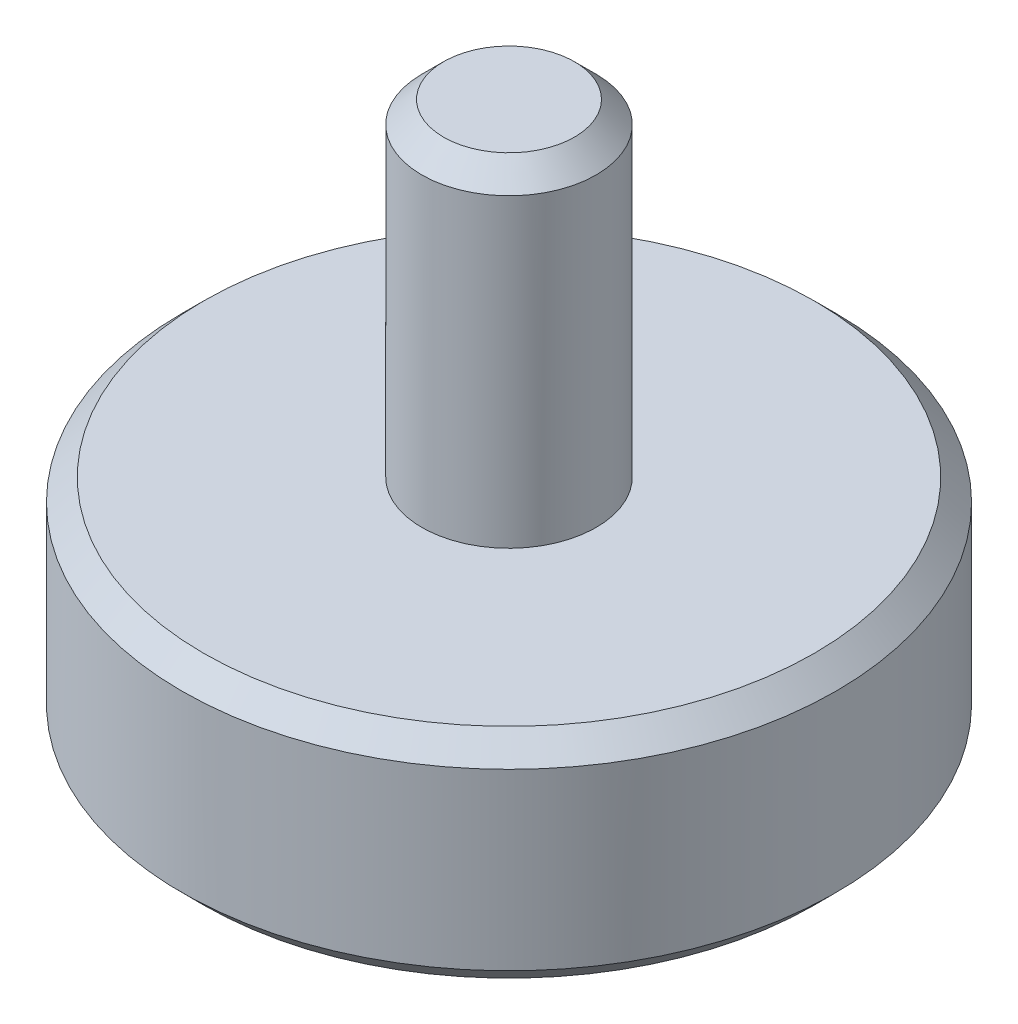
ISO-10303-21;
HEADER;
FILE_DESCRIPTION(('STEP AP214'),'2;1');
FILE_NAME('part.step','',(''),(''),'','','');
FILE_SCHEMA(('AUTOMOTIVE_DESIGN { 1 0 10303 214 1 1 1 1 }'));
ENDSEC;
DATA;
#1=APPLICATION_CONTEXT('core data for automotive mechanical design processes');
#2=APPLICATION_PROTOCOL_DEFINITION('international standard','automotive_design',2000,#1);
#3=PRODUCT_CONTEXT('',#1,'mechanical');
#4=PRODUCT('Part','Part','',(#3));
#5=PRODUCT_RELATED_PRODUCT_CATEGORY('part','',(#4));
#6=PRODUCT_DEFINITION_FORMATION('','',#4);
#7=PRODUCT_DEFINITION_CONTEXT('part definition',#1,'design');
#8=PRODUCT_DEFINITION('design','',#6,#7);
#9=PRODUCT_DEFINITION_SHAPE('','',#8);
#10=(LENGTH_UNIT() NAMED_UNIT(*) SI_UNIT(.MILLI.,.METRE.));
#11=(NAMED_UNIT(*) PLANE_ANGLE_UNIT() SI_UNIT($,.RADIAN.));
#12=(NAMED_UNIT(*) SI_UNIT($,.STERADIAN.) SOLID_ANGLE_UNIT());
#13=UNCERTAINTY_MEASURE_WITH_UNIT(LENGTH_MEASURE(1.E-05),#10,'distance_accuracy_value','');
#14=(GEOMETRIC_REPRESENTATION_CONTEXT(3) GLOBAL_UNCERTAINTY_ASSIGNED_CONTEXT((#13)) GLOBAL_UNIT_ASSIGNED_CONTEXT((#10,
#11,#12)) REPRESENTATION_CONTEXT('',''));
#15=CARTESIAN_POINT('',(0.,0.,0.));
#16=DIRECTION('',(0.,0.,1.));
#17=DIRECTION('',(1.,0.,0.));
#18=AXIS2_PLACEMENT_3D('',#15,#16,#17);
#19=CARTESIAN_POINT('',(0.,25.,0.));
#20=DIRECTION('',(0.,1.,0.));
#21=DIRECTION('',(0.,0.,1.));
#22=AXIS2_PLACEMENT_3D('',#19,#20,#21);
#23=PLANE('',#22);
#24=CARTESIAN_POINT('',(0.,25.,0.));
#25=DIRECTION('',(0.,1.,0.));
#26=DIRECTION('',(0.,0.,1.));
#27=AXIS2_PLACEMENT_3D('',#24,#25,#26);
#28=CIRCLE('',#27,3.);
#29=CARTESIAN_POINT('',(0.,25.,3.));
#30=VERTEX_POINT('',#29);
#31=EDGE_CURVE('E55',#30,#30,#28,.T.);
#32=ORIENTED_EDGE('',*,*,#31,.T.);
#33=EDGE_LOOP('',(#32));
#34=FACE_BOUND('',#33,.T.);
#35=ADVANCED_FACE('F34',(#34),#23,.T.);
#36=CARTESIAN_POINT('',(0.,0.,0.));
#37=DIRECTION('',(0.,-1.,0.));
#38=DIRECTION('',(0.,0.,-1.));
#39=AXIS2_PLACEMENT_3D('',#36,#37,#38);
#40=CYLINDRICAL_SURFACE('',#39,4.);
#41=CARTESIAN_POINT('',(0.,24.,0.));
#42=DIRECTION('',(0.,1.,0.));
#43=DIRECTION('',(0.,0.,1.));
#44=AXIS2_PLACEMENT_3D('',#41,#42,#43);
#45=CIRCLE('',#44,4.);
#46=CARTESIAN_POINT('',(0.,24.,4.));
#47=VERTEX_POINT('',#46);
#48=EDGE_CURVE('E58',#47,#47,#45,.F.);
#49=ORIENTED_EDGE('',*,*,#48,.T.);
#50=EDGE_LOOP('',(#49));
#51=FACE_BOUND('',#50,.T.);
#52=CARTESIAN_POINT('',(0.,10.,0.));
#53=DIRECTION('',(0.,-1.,0.));
#54=DIRECTION('',(0.,0.,-1.));
#55=AXIS2_PLACEMENT_3D('',#52,#53,#54);
#56=CIRCLE('',#55,4.);
#57=CARTESIAN_POINT('',(0.,10.,-4.));
#58=VERTEX_POINT('',#57);
#59=EDGE_CURVE('E61',#58,#58,#56,.T.);
#60=ORIENTED_EDGE('',*,*,#59,.F.);
#61=EDGE_LOOP('',(#60));
#62=FACE_BOUND('',#61,.T.);
#63=ADVANCED_FACE('F67',(#51,#62),#40,.T.);
#64=CARTESIAN_POINT('',(4.,10.,0.));
#65=DIRECTION('',(0.,1.,0.));
#66=DIRECTION('',(0.,0.,1.));
#67=AXIS2_PLACEMENT_3D('',#64,#65,#66);
#68=PLANE('',#67);
#69=CARTESIAN_POINT('',(0.,10.,0.));
#70=DIRECTION('',(0.,1.,0.));
#71=DIRECTION('',(0.,0.,1.));
#72=AXIS2_PLACEMENT_3D('',#69,#70,#71);
#73=CIRCLE('',#72,14.);
#74=CARTESIAN_POINT('',(0.,10.,14.));
#75=VERTEX_POINT('',#74);
#76=EDGE_CURVE('E10',#75,#75,#73,.T.);
#77=ORIENTED_EDGE('',*,*,#76,.T.);
#78=EDGE_LOOP('',(#77));
#79=FACE_BOUND('',#78,.T.);
#80=ORIENTED_EDGE('',*,*,#59,.T.);
#81=EDGE_LOOP('',(#80));
#82=FACE_BOUND('',#81,.T.);
#83=ADVANCED_FACE('F65',(#79,#82),#68,.T.);
#84=CARTESIAN_POINT('',(0.,0.,0.));
#85=DIRECTION('',(0.,-1.,0.));
#86=DIRECTION('',(0.,0.,-1.));
#87=AXIS2_PLACEMENT_3D('',#84,#85,#86);
#88=CYLINDRICAL_SURFACE('',#87,15.);
#89=CARTESIAN_POINT('',(0.,1.00000000000001,0.));
#90=DIRECTION('',(0.,-1.,0.));
#91=DIRECTION('',(0.,0.,-1.));
#92=AXIS2_PLACEMENT_3D('',#89,#90,#91);
#93=CIRCLE('',#92,15.);
#94=CARTESIAN_POINT('',(0.,1.00000000000001,-15.));
#95=VERTEX_POINT('',#94);
#96=EDGE_CURVE('E42',#95,#95,#93,.F.);
#97=ORIENTED_EDGE('',*,*,#96,.T.);
#98=EDGE_LOOP('',(#97));
#99=FACE_BOUND('',#98,.T.);
#100=CARTESIAN_POINT('',(0.,8.99999999999998,0.));
#101=DIRECTION('',(0.,1.,0.));
#102=DIRECTION('',(0.,0.,1.));
#103=AXIS2_PLACEMENT_3D('',#100,#101,#102);
#104=CIRCLE('',#103,15.);
#105=CARTESIAN_POINT('',(0.,8.99999999999998,15.));
#106=VERTEX_POINT('',#105);
#107=EDGE_CURVE('E46',#106,#106,#104,.F.);
#108=ORIENTED_EDGE('',*,*,#107,.T.);
#109=EDGE_LOOP('',(#108));
#110=FACE_BOUND('',#109,.T.);
#111=ADVANCED_FACE('F75',(#99,#110),#88,.T.);
#112=CARTESIAN_POINT('',(15.,0.,0.));
#113=DIRECTION('',(0.,-1.,0.));
#114=DIRECTION('',(0.,0.,-1.));
#115=AXIS2_PLACEMENT_3D('',#112,#113,#114);
#116=PLANE('',#115);
#117=CARTESIAN_POINT('',(0.,0.,0.));
#118=DIRECTION('',(0.,-1.,0.));
#119=DIRECTION('',(0.,0.,-1.));
#120=AXIS2_PLACEMENT_3D('',#117,#118,#119);
#121=CIRCLE('',#120,14.);
#122=CARTESIAN_POINT('',(0.,0.,-14.));
#123=VERTEX_POINT('',#122);
#124=EDGE_CURVE('E50',#123,#123,#121,.T.);
#125=ORIENTED_EDGE('',*,*,#124,.T.);
#126=EDGE_LOOP('',(#125));
#127=FACE_BOUND('',#126,.T.);
#128=ADVANCED_FACE('F88',(#127),#116,.T.);
#129=CARTESIAN_POINT('',(0.,24.,0.));
#130=DIRECTION('',(0.,-1.,0.));
#131=DIRECTION('',(0.,0.,-1.));
#132=AXIS2_PLACEMENT_3D('',#129,#130,#131);
#133=CONICAL_SURFACE('',#132,4.,0.785398163397452);
#134=ORIENTED_EDGE('',*,*,#31,.F.);
#135=EDGE_LOOP('',(#134));
#136=FACE_BOUND('',#135,.T.);
#137=ORIENTED_EDGE('',*,*,#48,.F.);
#138=EDGE_LOOP('',(#137));
#139=FACE_BOUND('',#138,.T.);
#140=ADVANCED_FACE('F82',(#136,#139),#133,.T.);
#141=CARTESIAN_POINT('',(0.,0.,0.));
#142=DIRECTION('',(0.,1.,0.));
#143=DIRECTION('',(0.,0.,1.));
#144=AXIS2_PLACEMENT_3D('',#141,#142,#143);
#145=CONICAL_SURFACE('',#144,14.,0.785398163397447);
#146=ORIENTED_EDGE('',*,*,#96,.F.);
#147=EDGE_LOOP('',(#146));
#148=FACE_BOUND('',#147,.T.);
#149=ORIENTED_EDGE('',*,*,#124,.F.);
#150=EDGE_LOOP('',(#149));
#151=FACE_BOUND('',#150,.T.);
#152=ADVANCED_FACE('F87',(#148,#151),#145,.T.);
#153=CARTESIAN_POINT('',(0.,8.99999999999998,0.));
#154=DIRECTION('',(0.,-1.,0.));
#155=DIRECTION('',(0.,0.,-1.));
#156=AXIS2_PLACEMENT_3D('',#153,#154,#155);
#157=CONICAL_SURFACE('',#156,15.,0.785398163397449);
#158=ORIENTED_EDGE('',*,*,#76,.F.);
#159=EDGE_LOOP('',(#158));
#160=FACE_BOUND('',#159,.T.);
#161=ORIENTED_EDGE('',*,*,#107,.F.);
#162=EDGE_LOOP('',(#161));
#163=FACE_BOUND('',#162,.T.);
#164=ADVANCED_FACE('F37',(#160,#163),#157,.T.);
#165=CLOSED_SHELL('',(#35,#63,#83,#111,#128,#140,#152,#164));
#166=MANIFOLD_SOLID_BREP('B2',#165);
#167=ADVANCED_BREP_SHAPE_REPRESENTATION('',(#18,#166),#14);
#168=SHAPE_DEFINITION_REPRESENTATION(#9,#167);
ENDSEC;
END-ISO-10303-21;
